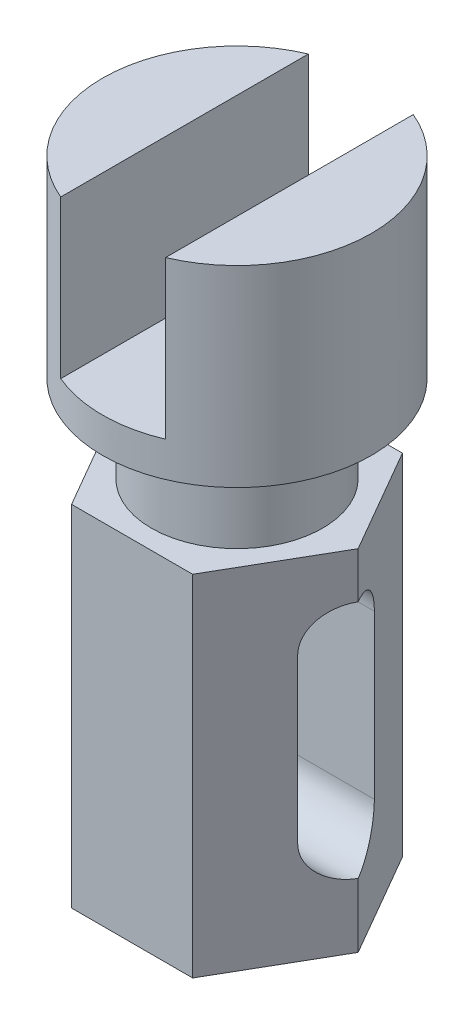
ISO-10303-21;
HEADER;
FILE_DESCRIPTION(('STEP AP214'),'2;1');
FILE_NAME('part.step','',(''),(''),'','','');
FILE_SCHEMA(('AUTOMOTIVE_DESIGN { 1 0 10303 214 1 1 1 1 }'));
ENDSEC;
DATA;
#1=APPLICATION_CONTEXT('core data for automotive mechanical design processes');
#2=APPLICATION_PROTOCOL_DEFINITION('international standard','automotive_design',2000,#1);
#3=PRODUCT_CONTEXT('',#1,'mechanical');
#4=PRODUCT('Part','Part','',(#3));
#5=PRODUCT_RELATED_PRODUCT_CATEGORY('part','',(#4));
#6=PRODUCT_DEFINITION_FORMATION('','',#4);
#7=PRODUCT_DEFINITION_CONTEXT('part definition',#1,'design');
#8=PRODUCT_DEFINITION('design','',#6,#7);
#9=PRODUCT_DEFINITION_SHAPE('','',#8);
#10=(LENGTH_UNIT() NAMED_UNIT(*) SI_UNIT(.MILLI.,.METRE.));
#11=(NAMED_UNIT(*) PLANE_ANGLE_UNIT() SI_UNIT($,.RADIAN.));
#12=(NAMED_UNIT(*) SI_UNIT($,.STERADIAN.) SOLID_ANGLE_UNIT());
#13=UNCERTAINTY_MEASURE_WITH_UNIT(LENGTH_MEASURE(1.E-05),#10,'distance_accuracy_value','');
#14=(GEOMETRIC_REPRESENTATION_CONTEXT(3) GLOBAL_UNCERTAINTY_ASSIGNED_CONTEXT((#13)) GLOBAL_UNIT_ASSIGNED_CONTEXT((#10,
#11,#12)) REPRESENTATION_CONTEXT('',''));
#15=CARTESIAN_POINT('',(0.,0.,0.));
#16=DIRECTION('',(0.,0.,1.));
#17=DIRECTION('',(1.,0.,0.));
#18=AXIS2_PLACEMENT_3D('',#15,#16,#17);
#19=CARTESIAN_POINT('',(0.,180.,0.));
#20=DIRECTION('',(0.,1.,0.));
#21=DIRECTION('',(0.,0.,1.));
#22=AXIS2_PLACEMENT_3D('',#19,#20,#21);
#23=PLANE('',#22);
#24=DIRECTION('',(0.,0.,-1.));
#25=VECTOR('',#24,1.);
#26=CARTESIAN_POINT('',(15.,180.,0.));
#27=LINE('',#26,#25);
#28=CARTESIAN_POINT('',(15.,180.,35.4161037210649));
#29=VERTEX_POINT('',#28);
#30=CARTESIAN_POINT('',(15.,180.,-35.4161037210649));
#31=VERTEX_POINT('',#30);
#32=EDGE_CURVE('E188',#29,#31,#27,.T.);
#33=ORIENTED_EDGE('',*,*,#32,.F.);
#34=CARTESIAN_POINT('',(0.,180.,0.));
#35=DIRECTION('',(0.,1.,0.));
#36=DIRECTION('',(0.,0.,1.));
#37=AXIS2_PLACEMENT_3D('',#34,#35,#36);
#38=CIRCLE('',#37,38.4616744666848);
#39=EDGE_CURVE('E265',#29,#31,#38,.T.);
#40=ORIENTED_EDGE('',*,*,#39,.T.);
#41=EDGE_LOOP('',(#33,#40));
#42=FACE_BOUND('',#41,.T.);
#43=ADVANCED_FACE('F43',(#42),#23,.T.);
#44=CARTESIAN_POINT('',(17.3205080756888,100.,30.));
#45=DIRECTION('',(-0.866025403784439,0.,-0.5));
#46=DIRECTION('',(-0.5,0.,0.866025403784439));
#47=AXIS2_PLACEMENT_3D('',#44,#45,#46);
#48=PLANE('',#47);
#49=DIRECTION('',(0.,1.,0.));
#50=VECTOR('',#49,1.);
#51=CARTESIAN_POINT('',(28.3133168770402,100.,10.9598966381691));
#52=LINE('',#51,#50);
#53=CARTESIAN_POINT('',(28.3133168770402,29.2857577663697,10.9598966381691));
#54=VERTEX_POINT('',#53);
#55=CARTESIAN_POINT('',(28.3133168770402,75.8690768477104,10.9598966381691));
#56=VERTEX_POINT('',#55);
#57=EDGE_CURVE('E320',#54,#56,#52,.T.);
#58=ORIENTED_EDGE('',*,*,#57,.T.);
#59=CARTESIAN_POINT('',(34.6410161513775,75.8690768477104,0.));
#60=DIRECTION('',(-0.866025403784439,0.,-0.5));
#61=DIRECTION('',(0.5,0.,-0.866025403784439));
#62=AXIS2_PLACEMENT_3D('',#59,#60,#61);
#63=ELLIPSE('',#62,12.6553985486748,10.9598966381691);
#64=CARTESIAN_POINT('',(34.6410161513775,86.8289734858795,0.));
#65=VERTEX_POINT('',#64);
#66=EDGE_CURVE('E172',#56,#65,#63,.T.);
#67=ORIENTED_EDGE('',*,*,#66,.T.);
#68=DIRECTION('',(0.,-1.,0.));
#69=VECTOR('',#68,1.);
#70=CARTESIAN_POINT('',(34.6410161513775,100.,0.));
#71=LINE('',#70,#69);
#72=CARTESIAN_POINT('',(34.6410161513775,100.,0.));
#73=VERTEX_POINT('',#72);
#74=EDGE_CURVE('E195',#73,#65,#71,.T.);
#75=ORIENTED_EDGE('',*,*,#74,.F.);
#76=DIRECTION('',(0.5,0.,-0.866025403784439));
#77=VECTOR('',#76,1.);
#78=CARTESIAN_POINT('',(17.3205080756888,100.,30.));
#79=LINE('',#78,#77);
#80=CARTESIAN_POINT('',(17.3205080756888,100.,30.));
#81=VERTEX_POINT('',#80);
#82=EDGE_CURVE('E223',#81,#73,#79,.T.);
#83=ORIENTED_EDGE('',*,*,#82,.F.);
#84=DIRECTION('',(0.,-1.,0.));
#85=VECTOR('',#84,1.);
#86=CARTESIAN_POINT('',(17.3205080756888,100.,30.));
#87=LINE('',#86,#85);
#88=CARTESIAN_POINT('',(17.3205080756888,0.,30.));
#89=VERTEX_POINT('',#88);
#90=EDGE_CURVE('E215',#81,#89,#87,.T.);
#91=ORIENTED_EDGE('',*,*,#90,.T.);
#92=DIRECTION('',(0.5,0.,-0.866025403784439));
#93=VECTOR('',#92,1.);
#94=CARTESIAN_POINT('',(17.3205080756888,0.,30.));
#95=LINE('',#94,#93);
#96=CARTESIAN_POINT('',(34.6410161513775,0.,0.));
#97=VERTEX_POINT('',#96);
#98=EDGE_CURVE('E237',#89,#97,#95,.T.);
#99=ORIENTED_EDGE('',*,*,#98,.T.);
#100=CARTESIAN_POINT('',(34.6410161513775,18.3258611282007,0.));
#101=VERTEX_POINT('',#100);
#102=EDGE_CURVE('E199',#101,#97,#71,.T.);
#103=ORIENTED_EDGE('',*,*,#102,.F.);
#104=CARTESIAN_POINT('',(34.6410161513775,29.2857577663697,0.));
#105=DIRECTION('',(-0.866025403784439,0.,-0.5));
#106=DIRECTION('',(0.5,0.,-0.866025403784439));
#107=AXIS2_PLACEMENT_3D('',#104,#105,#106);
#108=ELLIPSE('',#107,12.6553985486748,10.9598966381691);
#109=EDGE_CURVE('E59',#101,#54,#108,.T.);
#110=ORIENTED_EDGE('',*,*,#109,.T.);
#111=EDGE_LOOP('',(#58,#67,#75,#83,#91,#99,#103,#110));
#112=FACE_BOUND('',#111,.T.);
#113=ADVANCED_FACE('F45',(#112),#48,.F.);
#114=CARTESIAN_POINT('',(34.6410161513775,100.,0.));
#115=DIRECTION('',(-0.866025403784438,0.,0.5));
#116=DIRECTION('',(0.5,0.,0.866025403784439));
#117=AXIS2_PLACEMENT_3D('',#114,#115,#116);
#118=PLANE('',#117);
#119=ORIENTED_EDGE('',*,*,#74,.T.);
#120=CARTESIAN_POINT('',(34.6410161513775,75.8690768477104,0.));
#121=DIRECTION('',(-0.866025403784438,0.,0.5));
#122=DIRECTION('',(0.5,0.,0.866025403784439));
#123=AXIS2_PLACEMENT_3D('',#120,#121,#122);
#124=ELLIPSE('',#123,12.6553985486748,10.9598966381691);
#125=CARTESIAN_POINT('',(28.3133168770401,75.8690768477104,-10.9598966381691));
#126=VERTEX_POINT('',#125);
#127=EDGE_CURVE('E304',#65,#126,#124,.T.);
#128=ORIENTED_EDGE('',*,*,#127,.T.);
#129=DIRECTION('',(0.,-1.,0.));
#130=VECTOR('',#129,1.);
#131=CARTESIAN_POINT('',(28.3133168770401,100.,-10.9598966381691));
#132=LINE('',#131,#130);
#133=CARTESIAN_POINT('',(28.3133168770401,29.2857577663697,-10.9598966381691));
#134=VERTEX_POINT('',#133);
#135=EDGE_CURVE('E298',#126,#134,#132,.T.);
#136=ORIENTED_EDGE('',*,*,#135,.T.);
#137=CARTESIAN_POINT('',(34.6410161513775,29.2857577663697,0.));
#138=DIRECTION('',(-0.866025403784438,0.,0.5));
#139=DIRECTION('',(0.5,0.,0.866025403784439));
#140=AXIS2_PLACEMENT_3D('',#137,#138,#139);
#141=ELLIPSE('',#140,12.6553985486748,10.9598966381691);
#142=EDGE_CURVE('E313',#134,#101,#141,.T.);
#143=ORIENTED_EDGE('',*,*,#142,.T.);
#144=ORIENTED_EDGE('',*,*,#102,.T.);
#145=DIRECTION('',(-0.5,0.,-0.866025403784438));
#146=VECTOR('',#145,1.);
#147=CARTESIAN_POINT('',(34.6410161513775,0.,0.));
#148=LINE('',#147,#146);
#149=CARTESIAN_POINT('',(17.3205080756888,0.,-30.));
#150=VERTEX_POINT('',#149);
#151=EDGE_CURVE('E234',#97,#150,#148,.T.);
#152=ORIENTED_EDGE('',*,*,#151,.T.);
#153=DIRECTION('',(0.,-1.,0.));
#154=VECTOR('',#153,1.);
#155=CARTESIAN_POINT('',(17.3205080756888,100.,-30.));
#156=LINE('',#155,#154);
#157=CARTESIAN_POINT('',(17.3205080756888,100.,-30.));
#158=VERTEX_POINT('',#157);
#159=EDGE_CURVE('E200',#158,#150,#156,.T.);
#160=ORIENTED_EDGE('',*,*,#159,.F.);
#161=DIRECTION('',(-0.5,0.,-0.866025403784438));
#162=VECTOR('',#161,1.);
#163=CARTESIAN_POINT('',(34.6410161513775,100.,0.));
#164=LINE('',#163,#162);
#165=EDGE_CURVE('E253',#73,#158,#164,.T.);
#166=ORIENTED_EDGE('',*,*,#165,.F.);
#167=EDGE_LOOP('',(#119,#128,#136,#143,#144,#152,#160,#166));
#168=FACE_BOUND('',#167,.T.);
#169=ADVANCED_FACE('F335',(#168),#118,.F.);
#170=CARTESIAN_POINT('',(17.3205080756888,100.,-30.));
#171=DIRECTION('',(0.,0.,1.));
#172=DIRECTION('',(1.,0.,0.));
#173=AXIS2_PLACEMENT_3D('',#170,#171,#172);
#174=PLANE('',#173);
#175=DIRECTION('',(-1.,0.,0.));
#176=VECTOR('',#175,1.);
#177=CARTESIAN_POINT('',(17.3205080756888,0.,-30.));
#178=LINE('',#177,#176);
#179=CARTESIAN_POINT('',(-17.3205080756888,0.,-30.));
#180=VERTEX_POINT('',#179);
#181=EDGE_CURVE('E231',#150,#180,#178,.T.);
#182=ORIENTED_EDGE('',*,*,#181,.T.);
#183=DIRECTION('',(0.,-1.,0.));
#184=VECTOR('',#183,1.);
#185=CARTESIAN_POINT('',(-17.3205080756888,100.,-30.));
#186=LINE('',#185,#184);
#187=CARTESIAN_POINT('',(-17.3205080756888,100.,-30.));
#188=VERTEX_POINT('',#187);
#189=EDGE_CURVE('E204',#188,#180,#186,.T.);
#190=ORIENTED_EDGE('',*,*,#189,.F.);
#191=DIRECTION('',(-1.,0.,0.));
#192=VECTOR('',#191,1.);
#193=CARTESIAN_POINT('',(17.3205080756888,100.,-30.));
#194=LINE('',#193,#192);
#195=EDGE_CURVE('E250',#158,#188,#194,.T.);
#196=ORIENTED_EDGE('',*,*,#195,.F.);
#197=ORIENTED_EDGE('',*,*,#159,.T.);
#198=EDGE_LOOP('',(#182,#190,#196,#197));
#199=FACE_BOUND('',#198,.T.);
#200=ADVANCED_FACE('F416',(#199),#174,.F.);
#201=CARTESIAN_POINT('',(-17.3205080756888,100.,-30.));
#202=DIRECTION('',(0.866025403784439,0.,0.5));
#203=DIRECTION('',(0.5,0.,-0.866025403784439));
#204=AXIS2_PLACEMENT_3D('',#201,#202,#203);
#205=PLANE('',#204);
#206=DIRECTION('',(0.,1.,0.));
#207=VECTOR('',#206,1.);
#208=CARTESIAN_POINT('',(-28.3133168770401,100.,-10.9598966381691));
#209=LINE('',#208,#207);
#210=CARTESIAN_POINT('',(-28.3133168770401,29.2857577663697,-10.9598966381691));
#211=VERTEX_POINT('',#210);
#212=CARTESIAN_POINT('',(-28.3133168770401,75.8690768477104,-10.9598966381691));
#213=VERTEX_POINT('',#212);
#214=EDGE_CURVE('E11',#211,#213,#209,.T.);
#215=ORIENTED_EDGE('',*,*,#214,.T.);
#216=CARTESIAN_POINT('',(-34.6410161513775,75.8690768477104,0.));
#217=DIRECTION('',(0.866025403784439,0.,0.5));
#218=DIRECTION('',(0.5,0.,-0.866025403784439));
#219=AXIS2_PLACEMENT_3D('',#216,#217,#218);
#220=ELLIPSE('',#219,12.6553985486748,10.9598966381691);
#221=CARTESIAN_POINT('',(-34.6410161513775,86.8289734858795,0.));
#222=VERTEX_POINT('',#221);
#223=EDGE_CURVE('E308',#213,#222,#220,.T.);
#224=ORIENTED_EDGE('',*,*,#223,.T.);
#225=DIRECTION('',(0.,-1.,0.));
#226=VECTOR('',#225,1.);
#227=CARTESIAN_POINT('',(-34.6410161513775,100.,0.));
#228=LINE('',#227,#226);
#229=CARTESIAN_POINT('',(-34.6410161513775,100.,0.));
#230=VERTEX_POINT('',#229);
#231=EDGE_CURVE('E179',#230,#222,#228,.T.);
#232=ORIENTED_EDGE('',*,*,#231,.F.);
#233=DIRECTION('',(-0.5,0.,0.866025403784439));
#234=VECTOR('',#233,1.);
#235=CARTESIAN_POINT('',(-17.3205080756888,100.,-30.));
#236=LINE('',#235,#234);
#237=EDGE_CURVE('E247',#188,#230,#236,.T.);
#238=ORIENTED_EDGE('',*,*,#237,.F.);
#239=ORIENTED_EDGE('',*,*,#189,.T.);
#240=DIRECTION('',(-0.5,0.,0.866025403784439));
#241=VECTOR('',#240,1.);
#242=CARTESIAN_POINT('',(-17.3205080756888,0.,-30.));
#243=LINE('',#242,#241);
#244=CARTESIAN_POINT('',(-34.6410161513775,0.,0.));
#245=VERTEX_POINT('',#244);
#246=EDGE_CURVE('E227',#180,#245,#243,.T.);
#247=ORIENTED_EDGE('',*,*,#246,.T.);
#248=CARTESIAN_POINT('',(-34.6410161513775,18.3258611282006,0.));
#249=VERTEX_POINT('',#248);
#250=EDGE_CURVE('E210',#249,#245,#228,.T.);
#251=ORIENTED_EDGE('',*,*,#250,.F.);
#252=CARTESIAN_POINT('',(-34.6410161513775,29.2857577663697,0.));
#253=DIRECTION('',(0.866025403784439,0.,0.5));
#254=DIRECTION('',(0.5,0.,-0.866025403784439));
#255=AXIS2_PLACEMENT_3D('',#252,#253,#254);
#256=ELLIPSE('',#255,12.6553985486748,10.9598966381691);
#257=EDGE_CURVE('E316',#249,#211,#256,.T.);
#258=ORIENTED_EDGE('',*,*,#257,.T.);
#259=EDGE_LOOP('',(#215,#224,#232,#238,#239,#247,#251,#258));
#260=FACE_BOUND('',#259,.T.);
#261=ADVANCED_FACE('F345',(#260),#205,.F.);
#262=CARTESIAN_POINT('',(-34.6410161513775,100.,0.));
#263=DIRECTION('',(0.866025403784439,0.,-0.5));
#264=DIRECTION('',(-0.5,0.,-0.866025403784439));
#265=AXIS2_PLACEMENT_3D('',#262,#263,#264);
#266=PLANE('',#265);
#267=ORIENTED_EDGE('',*,*,#231,.T.);
#268=CARTESIAN_POINT('',(-34.6410161513776,75.8690768477104,0.));
#269=DIRECTION('',(0.866025403784439,0.,-0.5));
#270=DIRECTION('',(0.5,0.,0.866025403784439));
#271=AXIS2_PLACEMENT_3D('',#268,#269,#270);
#272=ELLIPSE('',#271,12.6553985486748,10.9598966381691);
#273=CARTESIAN_POINT('',(-28.3133168770402,75.8690768477104,10.9598966381691));
#274=VERTEX_POINT('',#273);
#275=EDGE_CURVE('E52',#222,#274,#272,.T.);
#276=ORIENTED_EDGE('',*,*,#275,.T.);
#277=DIRECTION('',(0.,-1.,0.));
#278=VECTOR('',#277,1.);
#279=CARTESIAN_POINT('',(-28.3133168770402,100.,10.9598966381691));
#280=LINE('',#279,#278);
#281=CARTESIAN_POINT('',(-28.3133168770402,29.2857577663697,10.9598966381691));
#282=VERTEX_POINT('',#281);
#283=EDGE_CURVE('E156',#274,#282,#280,.T.);
#284=ORIENTED_EDGE('',*,*,#283,.T.);
#285=CARTESIAN_POINT('',(-34.6410161513776,29.2857577663697,0.));
#286=DIRECTION('',(0.866025403784439,0.,-0.5));
#287=DIRECTION('',(0.5,0.,0.866025403784439));
#288=AXIS2_PLACEMENT_3D('',#285,#286,#287);
#289=ELLIPSE('',#288,12.6553985486748,10.9598966381691);
#290=EDGE_CURVE('E165',#282,#249,#289,.T.);
#291=ORIENTED_EDGE('',*,*,#290,.T.);
#292=ORIENTED_EDGE('',*,*,#250,.T.);
#293=DIRECTION('',(0.5,0.,0.866025403784439));
#294=VECTOR('',#293,1.);
#295=CARTESIAN_POINT('',(-34.6410161513775,0.,0.));
#296=LINE('',#295,#294);
#297=CARTESIAN_POINT('',(-17.3205080756888,0.,30.));
#298=VERTEX_POINT('',#297);
#299=EDGE_CURVE('E224',#245,#298,#296,.T.);
#300=ORIENTED_EDGE('',*,*,#299,.T.);
#301=DIRECTION('',(0.,-1.,0.));
#302=VECTOR('',#301,1.);
#303=CARTESIAN_POINT('',(-17.3205080756888,100.,30.));
#304=LINE('',#303,#302);
#305=CARTESIAN_POINT('',(-17.3205080756888,100.,30.));
#306=VERTEX_POINT('',#305);
#307=EDGE_CURVE('E211',#306,#298,#304,.T.);
#308=ORIENTED_EDGE('',*,*,#307,.F.);
#309=DIRECTION('',(0.5,0.,0.866025403784439));
#310=VECTOR('',#309,1.);
#311=CARTESIAN_POINT('',(-34.6410161513775,100.,0.));
#312=LINE('',#311,#310);
#313=EDGE_CURVE('E244',#230,#306,#312,.T.);
#314=ORIENTED_EDGE('',*,*,#313,.F.);
#315=EDGE_LOOP('',(#267,#276,#284,#291,#292,#300,#308,#314));
#316=FACE_BOUND('',#315,.T.);
#317=ADVANCED_FACE('F176',(#316),#266,.F.);
#318=CARTESIAN_POINT('',(-17.3205080756888,100.,30.));
#319=DIRECTION('',(0.,0.,-1.));
#320=DIRECTION('',(-1.,0.,0.));
#321=AXIS2_PLACEMENT_3D('',#318,#319,#320);
#322=PLANE('',#321);
#323=DIRECTION('',(1.,0.,0.));
#324=VECTOR('',#323,1.);
#325=CARTESIAN_POINT('',(-17.3205080756888,0.,30.));
#326=LINE('',#325,#324);
#327=EDGE_CURVE('E220',#298,#89,#326,.T.);
#328=ORIENTED_EDGE('',*,*,#327,.T.);
#329=ORIENTED_EDGE('',*,*,#90,.F.);
#330=DIRECTION('',(1.,0.,0.));
#331=VECTOR('',#330,1.);
#332=CARTESIAN_POINT('',(-17.3205080756888,100.,30.));
#333=LINE('',#332,#331);
#334=EDGE_CURVE('E219',#306,#81,#333,.T.);
#335=ORIENTED_EDGE('',*,*,#334,.F.);
#336=ORIENTED_EDGE('',*,*,#307,.T.);
#337=EDGE_LOOP('',(#328,#329,#335,#336));
#338=FACE_BOUND('',#337,.T.);
#339=ADVANCED_FACE('F404',(#338),#322,.F.);
#340=CARTESIAN_POINT('',(0.,100.,0.));
#341=DIRECTION('',(0.,1.,0.));
#342=DIRECTION('',(0.,0.,1.));
#343=AXIS2_PLACEMENT_3D('',#340,#341,#342);
#344=PLANE('',#343);
#345=CARTESIAN_POINT('',(0.,100.,0.));
#346=DIRECTION('',(0.,1.,0.));
#347=DIRECTION('',(0.,0.,1.));
#348=AXIS2_PLACEMENT_3D('',#345,#346,#347);
#349=CIRCLE('',#348,24.5);
#350=CARTESIAN_POINT('',(0.,100.,24.5));
#351=VERTEX_POINT('',#350);
#352=EDGE_CURVE('E194',#351,#351,#349,.T.);
#353=ORIENTED_EDGE('',*,*,#352,.F.);
#354=EDGE_LOOP('',(#353));
#355=FACE_BOUND('',#354,.T.);
#356=ORIENTED_EDGE('',*,*,#82,.T.);
#357=ORIENTED_EDGE('',*,*,#165,.T.);
#358=ORIENTED_EDGE('',*,*,#195,.T.);
#359=ORIENTED_EDGE('',*,*,#237,.T.);
#360=ORIENTED_EDGE('',*,*,#313,.T.);
#361=ORIENTED_EDGE('',*,*,#334,.T.);
#362=EDGE_LOOP('',(#356,#357,#358,#359,#360,#361));
#363=FACE_BOUND('',#362,.T.);
#364=ADVANCED_FACE('F401',(#355,#363),#344,.T.);
#365=CARTESIAN_POINT('',(0.,0.,0.));
#366=DIRECTION('',(0.,1.,0.));
#367=DIRECTION('',(0.,0.,1.));
#368=AXIS2_PLACEMENT_3D('',#365,#366,#367);
#369=PLANE('',#368);
#370=ORIENTED_EDGE('',*,*,#98,.F.);
#371=ORIENTED_EDGE('',*,*,#327,.F.);
#372=ORIENTED_EDGE('',*,*,#299,.F.);
#373=ORIENTED_EDGE('',*,*,#246,.F.);
#374=ORIENTED_EDGE('',*,*,#181,.F.);
#375=ORIENTED_EDGE('',*,*,#151,.F.);
#376=EDGE_LOOP('',(#370,#371,#372,#373,#374,#375));
#377=FACE_BOUND('',#376,.T.);
#378=ADVANCED_FACE('F397',(#377),#369,.F.);
#379=CARTESIAN_POINT('',(0.,125.,0.));
#380=DIRECTION('',(0.,-1.,0.));
#381=DIRECTION('',(0.,0.,-1.));
#382=AXIS2_PLACEMENT_3D('',#379,#380,#381);
#383=CYLINDRICAL_SURFACE('',#382,24.5);
#384=CARTESIAN_POINT('',(0.,125.,0.));
#385=DIRECTION('',(0.,1.,0.));
#386=DIRECTION('',(0.,0.,1.));
#387=AXIS2_PLACEMENT_3D('',#384,#385,#386);
#388=CIRCLE('',#387,24.5);
#389=CARTESIAN_POINT('',(0.,125.,24.5));
#390=VERTEX_POINT('',#389);
#391=EDGE_CURVE('E241',#390,#390,#388,.T.);
#392=ORIENTED_EDGE('',*,*,#391,.F.);
#393=EDGE_LOOP('',(#392));
#394=FACE_BOUND('',#393,.T.);
#395=ORIENTED_EDGE('',*,*,#352,.T.);
#396=EDGE_LOOP('',(#395));
#397=FACE_BOUND('',#396,.T.);
#398=ADVANCED_FACE('F392',(#394,#397),#383,.T.);
#399=CARTESIAN_POINT('',(0.,180.,0.));
#400=DIRECTION('',(0.,-1.,0.));
#401=DIRECTION('',(0.,0.,-1.));
#402=AXIS2_PLACEMENT_3D('',#399,#400,#401);
#403=CYLINDRICAL_SURFACE('',#402,38.4616744666848);
#404=ORIENTED_EDGE('',*,*,#39,.F.);
#405=DIRECTION('',(0.,-1.,0.));
#406=VECTOR('',#405,1.);
#407=CARTESIAN_POINT('',(15.,180.,35.4161037210649));
#408=LINE('',#407,#406);
#409=CARTESIAN_POINT('',(15.,135.,35.4161037210649));
#410=VERTEX_POINT('',#409);
#411=EDGE_CURVE('E271',#29,#410,#408,.T.);
#412=ORIENTED_EDGE('',*,*,#411,.T.);
#413=CARTESIAN_POINT('',(0.,135.,0.));
#414=DIRECTION('',(0.,-1.,0.));
#415=DIRECTION('',(0.,0.,-1.));
#416=AXIS2_PLACEMENT_3D('',#413,#414,#415);
#417=CIRCLE('',#416,38.4616744666848);
#418=CARTESIAN_POINT('',(-15.,135.,35.4161037210649));
#419=VERTEX_POINT('',#418);
#420=EDGE_CURVE('E166',#410,#419,#417,.T.);
#421=ORIENTED_EDGE('',*,*,#420,.T.);
#422=DIRECTION('',(0.,-1.,0.));
#423=VECTOR('',#422,1.);
#424=CARTESIAN_POINT('',(-15.,180.,35.4161037210649));
#425=LINE('',#424,#423);
#426=CARTESIAN_POINT('',(-15.,180.,35.4161037210649));
#427=VERTEX_POINT('',#426);
#428=EDGE_CURVE('E286',#419,#427,#425,.F.);
#429=ORIENTED_EDGE('',*,*,#428,.T.);
#430=CARTESIAN_POINT('',(-15.,180.,-35.4161037210649));
#431=VERTEX_POINT('',#430);
#432=EDGE_CURVE('E270',#431,#427,#38,.T.);
#433=ORIENTED_EDGE('',*,*,#432,.F.);
#434=DIRECTION('',(0.,-1.,0.));
#435=VECTOR('',#434,1.);
#436=CARTESIAN_POINT('',(-15.,180.,-35.4161037210649));
#437=LINE('',#436,#435);
#438=CARTESIAN_POINT('',(-15.,135.,-35.4161037210649));
#439=VERTEX_POINT('',#438);
#440=EDGE_CURVE('E282',#431,#439,#437,.T.);
#441=ORIENTED_EDGE('',*,*,#440,.T.);
#442=CARTESIAN_POINT('',(15.,135.,-35.4161037210649));
#443=VERTEX_POINT('',#442);
#444=EDGE_CURVE('E184',#439,#443,#417,.T.);
#445=ORIENTED_EDGE('',*,*,#444,.T.);
#446=DIRECTION('',(0.,-1.,0.));
#447=VECTOR('',#446,1.);
#448=CARTESIAN_POINT('',(15.,180.,-35.4161037210649));
#449=LINE('',#448,#447);
#450=EDGE_CURVE('E278',#443,#31,#449,.F.);
#451=ORIENTED_EDGE('',*,*,#450,.T.);
#452=EDGE_LOOP('',(#404,#412,#421,#429,#433,#441,#445,#451));
#453=FACE_BOUND('',#452,.T.);
#454=CARTESIAN_POINT('',(0.,125.,0.));
#455=DIRECTION('',(0.,1.,0.));
#456=DIRECTION('',(0.,0.,1.));
#457=AXIS2_PLACEMENT_3D('',#454,#455,#456);
#458=CIRCLE('',#457,38.4616744666848);
#459=CARTESIAN_POINT('',(0.,125.,38.4616744666848));
#460=VERTEX_POINT('',#459);
#461=EDGE_CURVE('E266',#460,#460,#458,.T.);
#462=ORIENTED_EDGE('',*,*,#461,.T.);
#463=EDGE_LOOP('',(#462));
#464=FACE_BOUND('',#463,.T.);
#465=ADVANCED_FACE('F357',(#453,#464),#403,.T.);
#466=DIRECTION('',(0.,0.,1.));
#467=VECTOR('',#466,1.);
#468=CARTESIAN_POINT('',(-15.,180.,0.));
#469=LINE('',#468,#467);
#470=EDGE_CURVE('E191',#431,#427,#469,.T.);
#471=ORIENTED_EDGE('',*,*,#470,.F.);
#472=ORIENTED_EDGE('',*,*,#432,.T.);
#473=EDGE_LOOP('',(#471,#472));
#474=FACE_BOUND('',#473,.T.);
#475=ADVANCED_FACE('F354',(#474),#23,.T.);
#476=CARTESIAN_POINT('',(0.,125.,0.));
#477=DIRECTION('',(0.,1.,0.));
#478=DIRECTION('',(0.,0.,1.));
#479=AXIS2_PLACEMENT_3D('',#476,#477,#478);
#480=PLANE('',#479);
#481=ORIENTED_EDGE('',*,*,#391,.T.);
#482=EDGE_LOOP('',(#481));
#483=FACE_BOUND('',#482,.T.);
#484=ORIENTED_EDGE('',*,*,#461,.F.);
#485=EDGE_LOOP('',(#484));
#486=FACE_BOUND('',#485,.T.);
#487=ADVANCED_FACE('F378',(#483,#486),#480,.F.);
#488=CARTESIAN_POINT('',(0.,135.,0.));
#489=DIRECTION('',(0.,-1.,0.));
#490=DIRECTION('',(0.,0.,-1.));
#491=AXIS2_PLACEMENT_3D('',#488,#489,#490);
#492=PLANE('',#491);
#493=DIRECTION('',(0.,0.,-1.));
#494=VECTOR('',#493,1.);
#495=CARTESIAN_POINT('',(15.,135.,39.4745308438405));
#496=LINE('',#495,#494);
#497=EDGE_CURVE('E294',#410,#443,#496,.T.);
#498=ORIENTED_EDGE('',*,*,#497,.T.);
#499=ORIENTED_EDGE('',*,*,#444,.F.);
#500=DIRECTION('',(0.,0.,1.));
#501=VECTOR('',#500,1.);
#502=CARTESIAN_POINT('',(-15.,135.,39.4745308438405));
#503=LINE('',#502,#501);
#504=EDGE_CURVE('E290',#439,#419,#503,.T.);
#505=ORIENTED_EDGE('',*,*,#504,.T.);
#506=ORIENTED_EDGE('',*,*,#420,.F.);
#507=EDGE_LOOP('',(#498,#499,#505,#506));
#508=FACE_BOUND('',#507,.T.);
#509=ADVANCED_FACE('F364',(#508),#492,.F.);
#510=CARTESIAN_POINT('',(15.,135.,39.4745308438405));
#511=DIRECTION('',(1.,0.,0.));
#512=DIRECTION('',(0.,0.,-1.));
#513=AXIS2_PLACEMENT_3D('',#510,#511,#512);
#514=PLANE('',#513);
#515=ORIENTED_EDGE('',*,*,#32,.T.);
#516=ORIENTED_EDGE('',*,*,#450,.F.);
#517=ORIENTED_EDGE('',*,*,#497,.F.);
#518=ORIENTED_EDGE('',*,*,#411,.F.);
#519=EDGE_LOOP('',(#515,#516,#517,#518));
#520=FACE_BOUND('',#519,.T.);
#521=ADVANCED_FACE('F369',(#520),#514,.F.);
#522=CARTESIAN_POINT('',(-15.,135.,39.4745308438405));
#523=DIRECTION('',(-1.,0.,0.));
#524=DIRECTION('',(0.,0.,1.));
#525=AXIS2_PLACEMENT_3D('',#522,#523,#524);
#526=PLANE('',#525);
#527=ORIENTED_EDGE('',*,*,#470,.T.);
#528=ORIENTED_EDGE('',*,*,#428,.F.);
#529=ORIENTED_EDGE('',*,*,#504,.F.);
#530=ORIENTED_EDGE('',*,*,#440,.F.);
#531=EDGE_LOOP('',(#527,#528,#529,#530));
#532=FACE_BOUND('',#531,.T.);
#533=ADVANCED_FACE('F362',(#532),#526,.F.);
#534=CARTESIAN_POINT('',(-42.5,75.8690768477104,-10.9598966381691));
#535=DIRECTION('',(0.,0.,-1.));
#536=DIRECTION('',(-1.,0.,0.));
#537=AXIS2_PLACEMENT_3D('',#534,#535,#536);
#538=PLANE('',#537);
#539=DIRECTION('',(1.,0.,0.));
#540=VECTOR('',#539,1.);
#541=CARTESIAN_POINT('',(-42.5,75.8690768477104,-10.9598966381691));
#542=LINE('',#541,#540);
#543=EDGE_CURVE('E322',#213,#126,#542,.T.);
#544=ORIENTED_EDGE('',*,*,#543,.F.);
#545=ORIENTED_EDGE('',*,*,#214,.F.);
#546=DIRECTION('',(1.,0.,0.));
#547=VECTOR('',#546,1.);
#548=CARTESIAN_POINT('',(-42.5,29.2857577663697,-10.9598966381691));
#549=LINE('',#548,#547);
#550=EDGE_CURVE('E326',#211,#134,#549,.T.);
#551=ORIENTED_EDGE('',*,*,#550,.T.);
#552=ORIENTED_EDGE('',*,*,#135,.F.);
#553=EDGE_LOOP('',(#544,#545,#551,#552));
#554=FACE_BOUND('',#553,.T.);
#555=ADVANCED_FACE('F376',(#554),#538,.F.);
#556=CARTESIAN_POINT('',(-42.5,75.8690768477104,0.));
#557=DIRECTION('',(1.,0.,0.));
#558=DIRECTION('',(0.,0.,-1.));
#559=AXIS2_PLACEMENT_3D('',#556,#557,#558);
#560=CYLINDRICAL_SURFACE('',#559,10.9598966381691);
#561=DIRECTION('',(1.,0.,0.));
#562=VECTOR('',#561,1.);
#563=CARTESIAN_POINT('',(-42.5,75.8690768477104,10.9598966381691));
#564=LINE('',#563,#562);
#565=EDGE_CURVE('E159',#274,#56,#564,.T.);
#566=ORIENTED_EDGE('',*,*,#565,.F.);
#567=ORIENTED_EDGE('',*,*,#275,.F.);
#568=ORIENTED_EDGE('',*,*,#223,.F.);
#569=ORIENTED_EDGE('',*,*,#543,.T.);
#570=ORIENTED_EDGE('',*,*,#127,.F.);
#571=ORIENTED_EDGE('',*,*,#66,.F.);
#572=EDGE_LOOP('',(#566,#567,#568,#569,#570,#571));
#573=FACE_BOUND('',#572,.T.);
#574=ADVANCED_FACE('F169',(#573),#560,.F.);
#575=CARTESIAN_POINT('',(-42.5,29.2857577663697,0.));
#576=DIRECTION('',(1.,0.,0.));
#577=DIRECTION('',(0.,0.,-1.));
#578=AXIS2_PLACEMENT_3D('',#575,#576,#577);
#579=CYLINDRICAL_SURFACE('',#578,10.9598966381691);
#580=ORIENTED_EDGE('',*,*,#142,.F.);
#581=ORIENTED_EDGE('',*,*,#550,.F.);
#582=ORIENTED_EDGE('',*,*,#257,.F.);
#583=ORIENTED_EDGE('',*,*,#290,.F.);
#584=DIRECTION('',(1.,0.,0.));
#585=VECTOR('',#584,1.);
#586=CARTESIAN_POINT('',(-42.5,29.2857577663697,10.9598966381691));
#587=LINE('',#586,#585);
#588=EDGE_CURVE('E66',#282,#54,#587,.T.);
#589=ORIENTED_EDGE('',*,*,#588,.T.);
#590=ORIENTED_EDGE('',*,*,#109,.F.);
#591=EDGE_LOOP('',(#580,#581,#582,#583,#589,#590));
#592=FACE_BOUND('',#591,.T.);
#593=ADVANCED_FACE('F341',(#592),#579,.F.);
#594=CARTESIAN_POINT('',(-42.5,75.8690768477104,10.9598966381691));
#595=DIRECTION('',(0.,0.,1.));
#596=DIRECTION('',(1.,0.,0.));
#597=AXIS2_PLACEMENT_3D('',#594,#595,#596);
#598=PLANE('',#597);
#599=ORIENTED_EDGE('',*,*,#588,.F.);
#600=ORIENTED_EDGE('',*,*,#283,.F.);
#601=ORIENTED_EDGE('',*,*,#565,.T.);
#602=ORIENTED_EDGE('',*,*,#57,.F.);
#603=EDGE_LOOP('',(#599,#600,#601,#602));
#604=FACE_BOUND('',#603,.T.);
#605=ADVANCED_FACE('F158',(#604),#598,.F.);
#606=CLOSED_SHELL('',(#43,#113,#169,#200,#261,#317,#339,#364,#378,#398,#465,#475,#487,#509,#521,
#533,#555,#574,#593,#605));
#607=MANIFOLD_SOLID_BREP('B2',#606);
#608=ADVANCED_BREP_SHAPE_REPRESENTATION('',(#18,#607),#14);
#609=SHAPE_DEFINITION_REPRESENTATION(#9,#608);
ENDSEC;
END-ISO-10303-21;
